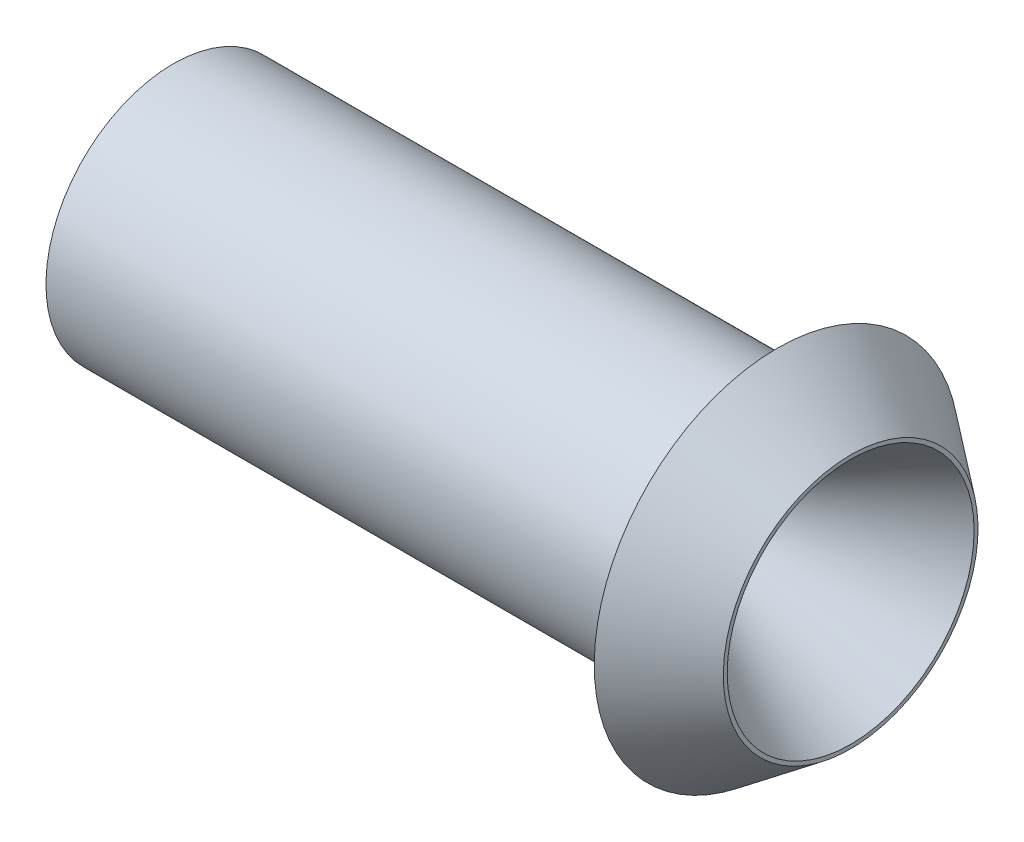
ISO-10303-21;
HEADER;
FILE_DESCRIPTION(('STEP AP214'),'2;1');
FILE_NAME('part.step','',(''),(''),'','','');
FILE_SCHEMA(('AUTOMOTIVE_DESIGN { 1 0 10303 214 1 1 1 1 }'));
ENDSEC;
DATA;
#1=APPLICATION_CONTEXT('core data for automotive mechanical design processes');
#2=APPLICATION_PROTOCOL_DEFINITION('international standard','automotive_design',2000,#1);
#3=PRODUCT_CONTEXT('',#1,'mechanical');
#4=PRODUCT('Part','Part','',(#3));
#5=PRODUCT_RELATED_PRODUCT_CATEGORY('part','',(#4));
#6=PRODUCT_DEFINITION_FORMATION('','',#4);
#7=PRODUCT_DEFINITION_CONTEXT('part definition',#1,'design');
#8=PRODUCT_DEFINITION('design','',#6,#7);
#9=PRODUCT_DEFINITION_SHAPE('','',#8);
#10=(LENGTH_UNIT() NAMED_UNIT(*) SI_UNIT(.MILLI.,.METRE.));
#11=(NAMED_UNIT(*) PLANE_ANGLE_UNIT() SI_UNIT($,.RADIAN.));
#12=(NAMED_UNIT(*) SI_UNIT($,.STERADIAN.) SOLID_ANGLE_UNIT());
#13=UNCERTAINTY_MEASURE_WITH_UNIT(LENGTH_MEASURE(1.E-05),#10,'distance_accuracy_value','');
#14=(GEOMETRIC_REPRESENTATION_CONTEXT(3) GLOBAL_UNCERTAINTY_ASSIGNED_CONTEXT((#13)) GLOBAL_UNIT_ASSIGNED_CONTEXT((#10,
#11,#12)) REPRESENTATION_CONTEXT('',''));
#15=CARTESIAN_POINT('',(0.,0.,0.));
#16=DIRECTION('',(0.,0.,1.));
#17=DIRECTION('',(1.,0.,0.));
#18=AXIS2_PLACEMENT_3D('',#15,#16,#17);
#19=CARTESIAN_POINT('',(32.6562615480863,0.,0.));
#20=DIRECTION('',(-1.,0.,0.));
#21=DIRECTION('',(0.,-1.,0.));
#22=AXIS2_PLACEMENT_3D('',#19,#20,#21);
#23=CONICAL_SURFACE('',#22,2.24281999999999,0.174532925199433);
#24=CARTESIAN_POINT('',(0.,0.,0.));
#25=DIRECTION('',(1.,0.,0.));
#26=DIRECTION('',(0.,1.,0.));
#27=AXIS2_PLACEMENT_3D('',#24,#25,#26);
#28=CIRCLE('',#27,8.00099999999999);
#29=CARTESIAN_POINT('',(0.,-8.00099999999999,0.));
#30=VERTEX_POINT('',#29);
#31=EDGE_CURVE('E82',#30,#30,#28,.T.);
#32=CARTESIAN_POINT('',(32.6562615480863,0.,0.));
#33=DIRECTION('',(1.,0.,0.));
#34=DIRECTION('',(0.,1.,0.));
#35=AXIS2_PLACEMENT_3D('',#32,#33,#34);
#36=CIRCLE('',#35,2.24281999999999);
#37=CARTESIAN_POINT('',(32.6562615480863,-2.24282,0.));
#38=VERTEX_POINT('',#37);
#39=EDGE_CURVE('E10',#38,#38,#36,.T.);
#40=CARTESIAN_POINT('',(0.,-8.00099999999999,0.));
#41=CARTESIAN_POINT('',(0.340169391125899,-7.94101895833333,0.));
#42=CARTESIAN_POINT('',(0.680338782251798,-7.88103791666666,0.));
#43=CARTESIAN_POINT('',(1.3606775645036,-7.76107583333333,0.));
#44=CARTESIAN_POINT('',(1.70084695562949,-7.70109479166666,0.));
#45=CARTESIAN_POINT('',(2.38118573788129,-7.58113270833333,0.));
#46=CARTESIAN_POINT('',(2.72135512900719,-7.52115166666666,0.));
#47=CARTESIAN_POINT('',(3.40169391125898,-7.40118958333333,0.));
#48=CARTESIAN_POINT('',(3.74186330238488,-7.34120854166666,0.));
#49=CARTESIAN_POINT('',(4.42220208463668,-7.22124645833333,0.));
#50=CARTESIAN_POINT('',(4.76237147576258,-7.16126541666666,0.));
#51=CARTESIAN_POINT('',(5.44271025801438,-7.04130333333333,0.));
#52=CARTESIAN_POINT('',(5.78287964914028,-6.98132229166666,0.));
#53=CARTESIAN_POINT('',(6.46321843139207,-6.86136020833333,0.));
#54=CARTESIAN_POINT('',(6.80338782251797,-6.80137916666666,0.));
#55=CARTESIAN_POINT('',(7.48372660476977,-6.68141708333333,0.));
#56=CARTESIAN_POINT('',(7.82389599589567,-6.62143604166666,0.));
#57=CARTESIAN_POINT('',(8.50423477814746,-6.50147395833333,0.));
#58=CARTESIAN_POINT('',(8.84440416927336,-6.44149291666666,0.));
#59=CARTESIAN_POINT('',(9.52474295152516,-6.32153083333333,0.));
#60=CARTESIAN_POINT('',(9.86491234265106,-6.26154979166666,0.));
#61=CARTESIAN_POINT('',(10.5452511249029,-6.14158770833333,0.));
#62=CARTESIAN_POINT('',(10.8854205160288,-6.08160666666666,0.));
#63=CARTESIAN_POINT('',(11.5657592982806,-5.96164458333333,0.));
#64=CARTESIAN_POINT('',(11.9059286894064,-5.90166354166666,0.));
#65=CARTESIAN_POINT('',(12.5862674716582,-5.78170145833333,0.));
#66=CARTESIAN_POINT('',(12.9264368627841,-5.72172041666666,0.));
#67=CARTESIAN_POINT('',(13.6067756450359,-5.60175833333333,0.));
#68=CARTESIAN_POINT('',(13.9469450361618,-5.54177729166666,0.));
#69=CARTESIAN_POINT('',(14.6272838184136,-5.42181520833333,0.));
#70=CARTESIAN_POINT('',(14.9674532095395,-5.36183416666666,0.));
#71=CARTESIAN_POINT('',(15.6477919917913,-5.24187208333333,0.));
#72=CARTESIAN_POINT('',(15.9879613829172,-5.18189104166666,0.));
#73=CARTESIAN_POINT('',(16.668300165169,-5.06192895833333,0.));
#74=CARTESIAN_POINT('',(17.0084695562949,-5.00194791666666,0.));
#75=CARTESIAN_POINT('',(17.6888083385467,-4.88198583333333,0.));
#76=CARTESIAN_POINT('',(18.0289777296726,-4.82200479166666,0.));
#77=CARTESIAN_POINT('',(18.7093165119244,-4.70204270833333,0.));
#78=CARTESIAN_POINT('',(19.0494859030503,-4.64206166666666,0.));
#79=CARTESIAN_POINT('',(19.7298246853021,-4.52209958333333,0.));
#80=CARTESIAN_POINT('',(20.069994076428,-4.46211854166666,0.));
#81=CARTESIAN_POINT('',(20.7503328586798,-4.34215645833333,0.));
#82=CARTESIAN_POINT('',(21.0905022498057,-4.28217541666666,0.));
#83=CARTESIAN_POINT('',(21.7708410320575,-4.16221333333333,0.));
#84=CARTESIAN_POINT('',(22.1110104231834,-4.10223229166666,0.));
#85=CARTESIAN_POINT('',(22.7913492054352,-3.98227020833333,0.));
#86=CARTESIAN_POINT('',(23.1315185965611,-3.92228916666666,0.));
#87=CARTESIAN_POINT('',(23.8118573788129,-3.80232708333333,0.));
#88=CARTESIAN_POINT('',(24.1520267699388,-3.74234604166666,0.));
#89=CARTESIAN_POINT('',(24.8323655521906,-3.62238395833333,0.));
#90=CARTESIAN_POINT('',(25.1725349433165,-3.56240291666666,0.));
#91=CARTESIAN_POINT('',(25.8528737255683,-3.44244083333333,0.));
#92=CARTESIAN_POINT('',(26.1930431166942,-3.38245979166666,0.));
#93=CARTESIAN_POINT('',(26.873381898946,-3.26249770833333,0.));
#94=CARTESIAN_POINT('',(27.2135512900719,-3.20251666666666,0.));
#95=CARTESIAN_POINT('',(27.8938900723237,-3.08255458333333,0.));
#96=CARTESIAN_POINT('',(28.2340594634496,-3.02257354166666,0.));
#97=CARTESIAN_POINT('',(28.9143982457014,-2.90261145833333,0.));
#98=CARTESIAN_POINT('',(29.2545676368273,-2.84263041666666,0.));
#99=CARTESIAN_POINT('',(29.9349064190791,-2.72266833333333,0.));
#100=CARTESIAN_POINT('',(30.275075810205,-2.66268729166666,0.));
#101=CARTESIAN_POINT('',(30.9554145924568,-2.54272520833333,0.));
#102=CARTESIAN_POINT('',(31.2955839835827,-2.48274416666666,0.));
#103=CARTESIAN_POINT('',(31.9759227658345,-2.36278208333333,0.));
#104=CARTESIAN_POINT('',(32.3160921569604,-2.30280104166666,0.));
#105=CARTESIAN_POINT('',(32.6562615480863,-2.24282,0.));
#106=B_SPLINE_CURVE_WITH_KNOTS('',3,(#40,#41,#42,#43,#44,#45,#46,#47,#48,#49,#50,#51,#52,#53,
#54,#55,#56,#57,#58,#59,#60,#61,#62,#63,#64,#65,#66,#67,#68,#69,#70,#71,#72,#73,#74,#75,#76,#77,
#78,#79,#80,#81,#82,#83,#84,#85,#86,#87,#88,#89,#90,#91,#92,#93,#94,#95,#96,#97,#98,#99,#100,
#101,#102,#103,#104,#105),.UNSPECIFIED.,.F.,.F.,(4,2,2,2,2,2,2,2,2,2,2,2,2,2,2,2,2,2,2,2,2,2,2,
2,2,2,2,2,2,2,2,2,4),(0.,1.03625115689463,2.07250231378925,3.10875347068387,4.1450046275785,
5.18125578447312,6.21750694136774,7.25375809826237,8.29000925515699,9.32626041205162,
10.3625115689462,11.3987627258409,12.4350138827355,13.4712650396301,14.5075161965247,
15.5437673534194,16.580018510314,17.6162696672086,18.6525208241032,19.6887719809978,
20.7250231378925,21.7612742947871,22.7975254516817,23.8337766085763,24.870027765471,
25.9062789223656,26.9425300792602,27.9787812361548,29.0150323930495,30.0512835499441,
31.0875347068387,32.1237858637333,33.160037020628),.UNSPECIFIED.);
#107=EDGE_CURVE('BSEAM45',#30,#38,#106,.T.);
#108=ORIENTED_EDGE('',*,*,#31,.F.);
#109=ORIENTED_EDGE('',*,*,#39,.T.);
#110=ORIENTED_EDGE('',*,*,#107,.T.);
#111=ORIENTED_EDGE('',*,*,#107,.F.);
#112=EDGE_LOOP('',(#108,#110,#109,#111));
#113=FACE_BOUND('',#112,.T.);
#114=ADVANCED_FACE('F45',(#113),#23,.F.);
#115=CARTESIAN_POINT('',(43.8997218672132,0.,0.));
#116=DIRECTION('',(1.,0.,0.));
#117=DIRECTION('',(0.,1.,0.));
#118=AXIS2_PLACEMENT_3D('',#115,#116,#117);
#119=CYLINDRICAL_SURFACE('',#118,2.24282);
#120=ORIENTED_EDGE('',*,*,#39,.F.);
#121=EDGE_LOOP('',(#120));
#122=FACE_BOUND('',#121,.T.);
#123=CARTESIAN_POINT('',(33.9262615480863,0.,0.));
#124=DIRECTION('',(1.,0.,0.));
#125=DIRECTION('',(0.,1.,0.));
#126=AXIS2_PLACEMENT_3D('',#123,#124,#125);
#127=CIRCLE('',#126,2.24282);
#128=CARTESIAN_POINT('',(33.9262615480863,2.24281999999999,0.));
#129=VERTEX_POINT('',#128);
#130=EDGE_CURVE('E52',#129,#129,#127,.T.);
#131=ORIENTED_EDGE('',*,*,#130,.T.);
#132=EDGE_LOOP('',(#131));
#133=FACE_BOUND('',#132,.T.);
#134=ADVANCED_FACE('F91',(#122,#133),#119,.F.);
#135=CARTESIAN_POINT('',(43.8997218672132,0.,0.));
#136=DIRECTION('',(1.,0.,0.));
#137=DIRECTION('',(0.,1.,0.));
#138=AXIS2_PLACEMENT_3D('',#135,#136,#137);
#139=CONICAL_SURFACE('',#138,8.001,0.523598775598301);
#140=CARTESIAN_POINT('',(43.8997218672132,0.,0.));
#141=DIRECTION('',(1.,0.,0.));
#142=DIRECTION('',(0.,1.,0.));
#143=AXIS2_PLACEMENT_3D('',#140,#141,#142);
#144=CIRCLE('',#143,8.001);
#145=CARTESIAN_POINT('',(43.8997218672132,8.00099999999999,0.));
#146=VERTEX_POINT('',#145);
#147=EDGE_CURVE('E58',#146,#146,#144,.T.);
#148=CARTESIAN_POINT('',(33.9262615480863,2.24281999999999,0.));
#149=CARTESIAN_POINT('',(34.0301517597438,2.30280104166666,0.));
#150=CARTESIAN_POINT('',(34.1340419714014,2.36278208333333,0.));
#151=CARTESIAN_POINT('',(34.3418223947166,2.48274416666666,0.));
#152=CARTESIAN_POINT('',(34.4457126063741,2.54272520833333,0.));
#153=CARTESIAN_POINT('',(34.6534930296893,2.66268729166666,0.));
#154=CARTESIAN_POINT('',(34.7573832413468,2.72266833333333,0.));
#155=CARTESIAN_POINT('',(34.965163664662,2.84263041666666,0.));
#156=CARTESIAN_POINT('',(35.0690538763196,2.90261145833333,0.));
#157=CARTESIAN_POINT('',(35.2768342996347,3.02257354166666,0.));
#158=CARTESIAN_POINT('',(35.3807245112923,3.08255458333333,0.));
#159=CARTESIAN_POINT('',(35.5885049346074,3.20251666666666,0.));
#160=CARTESIAN_POINT('',(35.692395146265,3.26249770833333,0.));
#161=CARTESIAN_POINT('',(35.9001755695801,3.38245979166666,0.));
#162=CARTESIAN_POINT('',(36.0040657812377,3.44244083333333,0.));
#163=CARTESIAN_POINT('',(36.2118462045528,3.56240291666666,0.));
#164=CARTESIAN_POINT('',(36.3157364162104,3.62238395833333,0.));
#165=CARTESIAN_POINT('',(36.5235168395256,3.74234604166666,0.));
#166=CARTESIAN_POINT('',(36.6274070511831,3.80232708333333,0.));
#167=CARTESIAN_POINT('',(36.8351874744983,3.92228916666666,0.));
#168=CARTESIAN_POINT('',(36.9390776861559,3.98227020833333,0.));
#169=CARTESIAN_POINT('',(37.146858109471,4.10223229166666,0.));
#170=CARTESIAN_POINT('',(37.2507483211286,4.16221333333333,0.));
#171=CARTESIAN_POINT('',(37.4585287444437,4.28217541666666,0.));
#172=CARTESIAN_POINT('',(37.5624189561013,4.34215645833333,0.));
#173=CARTESIAN_POINT('',(37.7701993794164,4.46211854166666,0.));
#174=CARTESIAN_POINT('',(37.874089591074,4.52209958333333,0.));
#175=CARTESIAN_POINT('',(38.0818700143891,4.64206166666666,0.));
#176=CARTESIAN_POINT('',(38.1857602260467,4.70204270833333,0.));
#177=CARTESIAN_POINT('',(38.3935406493619,4.82200479166666,0.));
#178=CARTESIAN_POINT('',(38.4974308610194,4.88198583333333,0.));
#179=CARTESIAN_POINT('',(38.7052112843346,5.00194791666666,0.));
#180=CARTESIAN_POINT('',(38.8091014959922,5.06192895833333,0.));
#181=CARTESIAN_POINT('',(39.0168819193073,5.18189104166666,0.));
#182=CARTESIAN_POINT('',(39.1207721309649,5.24187208333333,0.));
#183=CARTESIAN_POINT('',(39.32855255428,5.36183416666666,0.));
#184=CARTESIAN_POINT('',(39.4324427659376,5.42181520833333,0.));
#185=CARTESIAN_POINT('',(39.6402231892527,5.54177729166666,0.));
#186=CARTESIAN_POINT('',(39.7441134009103,5.60175833333333,0.));
#187=CARTESIAN_POINT('',(39.9518938242254,5.72172041666666,0.));
#188=CARTESIAN_POINT('',(40.055784035883,5.78170145833333,0.));
#189=CARTESIAN_POINT('',(40.2635644591982,5.90166354166666,0.));
#190=CARTESIAN_POINT('',(40.3674546708557,5.96164458333333,0.));
#191=CARTESIAN_POINT('',(40.5752350941709,6.08160666666666,0.));
#192=CARTESIAN_POINT('',(40.6791253058284,6.14158770833333,0.));
#193=CARTESIAN_POINT('',(40.8869057291436,6.26154979166666,0.));
#194=CARTESIAN_POINT('',(40.9907959408012,6.32153083333333,0.));
#195=CARTESIAN_POINT('',(41.1985763641163,6.44149291666666,0.));
#196=CARTESIAN_POINT('',(41.3024665757739,6.50147395833333,0.));
#197=CARTESIAN_POINT('',(41.510246999089,6.62143604166666,0.));
#198=CARTESIAN_POINT('',(41.6141372107466,6.68141708333333,0.));
#199=CARTESIAN_POINT('',(41.8219176340617,6.80137916666666,0.));
#200=CARTESIAN_POINT('',(41.9258078457193,6.86136020833333,0.));
#201=CARTESIAN_POINT('',(42.1335882690344,6.98132229166666,0.));
#202=CARTESIAN_POINT('',(42.237478480692,7.04130333333333,0.));
#203=CARTESIAN_POINT('',(42.4452589040072,7.16126541666666,0.));
#204=CARTESIAN_POINT('',(42.5491491156647,7.22124645833333,0.));
#205=CARTESIAN_POINT('',(42.7569295389799,7.34120854166666,0.));
#206=CARTESIAN_POINT('',(42.8608197506374,7.40118958333333,0.));
#207=CARTESIAN_POINT('',(43.0686001739526,7.52115166666666,0.));
#208=CARTESIAN_POINT('',(43.1724903856102,7.58113270833333,0.));
#209=CARTESIAN_POINT('',(43.3802708089253,7.70109479166666,0.));
#210=CARTESIAN_POINT('',(43.4841610205829,7.76107583333333,0.));
#211=CARTESIAN_POINT('',(43.691941443898,7.88103791666666,0.));
#212=CARTESIAN_POINT('',(43.7958316555556,7.94101895833333,0.));
#213=CARTESIAN_POINT('',(43.8997218672132,8.00099999999999,0.));
#214=B_SPLINE_CURVE_WITH_KNOTS('',3,(#148,#149,#150,#151,#152,#153,#154,#155,#156,#157,#158,
#159,#160,#161,#162,#163,#164,#165,#166,#167,#168,#169,#170,#171,#172,#173,#174,#175,#176,#177,
#178,#179,#180,#181,#182,#183,#184,#185,#186,#187,#188,#189,#190,#191,#192,#193,#194,#195,#196,
#197,#198,#199,#200,#201,#202,#203,#204,#205,#206,#207,#208,#209,#210,#211,#212,#213),
.UNSPECIFIED.,.F.,.F.,(4,2,2,2,2,2,2,2,2,2,2,2,2,2,2,2,2,2,2,2,2,2,2,2,2,2,2,2,2,2,2,2,4),(0.,
0.359886249999996,0.719772499999993,1.07965874999999,1.43954499999999,1.79943124999999,
2.15931749999999,2.51920374999999,2.87908999999998,3.23897624999999,3.59886249999998,
3.95874874999998,4.31863499999998,4.67852124999998,5.03840749999997,5.39829374999998,
5.75817999999997,6.11806624999997,6.47795249999997,6.83783874999997,7.19772499999997,
7.55761124999997,7.91749749999996,8.27738374999996,8.63726999999996,8.99715624999996,
9.35704249999996,9.71692874999996,10.076815,10.43670125,10.7965875,11.15647375,
11.5163599999999),.UNSPECIFIED.);
#215=EDGE_CURVE('BSEAM95',#129,#146,#214,.T.);
#216=ORIENTED_EDGE('',*,*,#130,.F.);
#217=ORIENTED_EDGE('',*,*,#147,.T.);
#218=ORIENTED_EDGE('',*,*,#215,.T.);
#219=ORIENTED_EDGE('',*,*,#215,.F.);
#220=EDGE_LOOP('',(#216,#218,#217,#219));
#221=FACE_BOUND('',#220,.T.);
#222=ADVANCED_FACE('F95',(#221),#139,.F.);
#223=CARTESIAN_POINT('',(43.8997218672132,0.,0.));
#224=DIRECTION('',(-1.,0.,0.));
#225=DIRECTION('',(0.,-1.,0.));
#226=AXIS2_PLACEMENT_3D('',#223,#224,#225);
#227=PLANE('',#226);
#228=ORIENTED_EDGE('',*,*,#147,.F.);
#229=EDGE_LOOP('',(#228));
#230=FACE_BOUND('',#229,.T.);
#231=CARTESIAN_POINT('',(43.8997218672132,0.,0.));
#232=DIRECTION('',(1.,0.,0.));
#233=DIRECTION('',(0.,1.,0.));
#234=AXIS2_PLACEMENT_3D('',#231,#232,#233);
#235=CIRCLE('',#234,8.255);
#236=CARTESIAN_POINT('',(43.8997218672132,8.25499999999999,0.));
#237=VERTEX_POINT('',#236);
#238=EDGE_CURVE('E64',#237,#237,#235,.T.);
#239=ORIENTED_EDGE('',*,*,#238,.T.);
#240=EDGE_LOOP('',(#239));
#241=FACE_BOUND('',#240,.T.);
#242=ADVANCED_FACE('F100',(#230,#241),#227,.F.);
#243=CARTESIAN_POINT('',(39.1301900738272,0.,0.));
#244=DIRECTION('',(-1.,0.,0.));
#245=DIRECTION('',(0.,-1.,0.));
#246=AXIS2_PLACEMENT_3D('',#243,#244,#245);
#247=CONICAL_SURFACE('',#246,11.8491,0.645771823237897);
#248=ORIENTED_EDGE('',*,*,#238,.F.);
#249=EDGE_LOOP('',(#248));
#250=FACE_BOUND('',#249,.T.);
#251=CARTESIAN_POINT('',(39.1301900738272,0.,0.));
#252=DIRECTION('',(1.,0.,0.));
#253=DIRECTION('',(0.,1.,0.));
#254=AXIS2_PLACEMENT_3D('',#251,#252,#253);
#255=CIRCLE('',#254,11.8491);
#256=CARTESIAN_POINT('',(39.1301900738272,11.8491,0.));
#257=VERTEX_POINT('',#256);
#258=EDGE_CURVE('E70',#257,#257,#255,.T.);
#259=ORIENTED_EDGE('',*,*,#258,.T.);
#260=EDGE_LOOP('',(#259));
#261=FACE_BOUND('',#260,.T.);
#262=ADVANCED_FACE('F106',(#250,#261),#247,.T.);
#263=CARTESIAN_POINT('',(39.1301900738272,0.,0.));
#264=DIRECTION('',(1.,0.,0.));
#265=DIRECTION('',(0.,1.,0.));
#266=AXIS2_PLACEMENT_3D('',#263,#264,#265);
#267=PLANE('',#266);
#268=ORIENTED_EDGE('',*,*,#258,.F.);
#269=EDGE_LOOP('',(#268));
#270=FACE_BOUND('',#269,.T.);
#271=CARTESIAN_POINT('',(39.1301900738272,0.,0.));
#272=DIRECTION('',(1.,0.,0.));
#273=DIRECTION('',(0.,1.,0.));
#274=AXIS2_PLACEMENT_3D('',#271,#272,#273);
#275=CIRCLE('',#274,8.255);
#276=CARTESIAN_POINT('',(39.1301900738272,8.255,0.));
#277=VERTEX_POINT('',#276);
#278=EDGE_CURVE('E74',#277,#277,#275,.T.);
#279=ORIENTED_EDGE('',*,*,#278,.T.);
#280=EDGE_LOOP('',(#279));
#281=FACE_BOUND('',#280,.T.);
#282=ADVANCED_FACE('F110',(#270,#281),#267,.F.);
#283=CARTESIAN_POINT('',(43.8997218672132,0.,0.));
#284=DIRECTION('',(1.,0.,0.));
#285=DIRECTION('',(0.,1.,0.));
#286=AXIS2_PLACEMENT_3D('',#283,#284,#285);
#287=CYLINDRICAL_SURFACE('',#286,8.255);
#288=ORIENTED_EDGE('',*,*,#278,.F.);
#289=EDGE_LOOP('',(#288));
#290=FACE_BOUND('',#289,.T.);
#291=CARTESIAN_POINT('',(0.,0.,0.));
#292=DIRECTION('',(1.,0.,0.));
#293=DIRECTION('',(0.,1.,0.));
#294=AXIS2_PLACEMENT_3D('',#291,#292,#293);
#295=CIRCLE('',#294,8.25499999999999);
#296=CARTESIAN_POINT('',(0.,8.25499999999999,0.));
#297=VERTEX_POINT('',#296);
#298=EDGE_CURVE('E78',#297,#297,#295,.T.);
#299=ORIENTED_EDGE('',*,*,#298,.T.);
#300=EDGE_LOOP('',(#299));
#301=FACE_BOUND('',#300,.T.);
#302=ADVANCED_FACE('F114',(#290,#301),#287,.T.);
#303=CARTESIAN_POINT('',(0.,0.,0.));
#304=DIRECTION('',(1.,0.,0.));
#305=DIRECTION('',(0.,1.,0.));
#306=AXIS2_PLACEMENT_3D('',#303,#304,#305);
#307=PLANE('',#306);
#308=ORIENTED_EDGE('',*,*,#298,.F.);
#309=EDGE_LOOP('',(#308));
#310=FACE_BOUND('',#309,.T.);
#311=ORIENTED_EDGE('',*,*,#31,.T.);
#312=EDGE_LOOP('',(#311));
#313=FACE_BOUND('',#312,.T.);
#314=ADVANCED_FACE('F88',(#310,#313),#307,.F.);
#315=CLOSED_SHELL('',(#114,#134,#222,#242,#262,#282,#302,#314));
#316=MANIFOLD_SOLID_BREP('B2',#315);
#317=ADVANCED_BREP_SHAPE_REPRESENTATION('',(#18,#316),#14);
#318=SHAPE_DEFINITION_REPRESENTATION(#9,#317);
ENDSEC;
END-ISO-10303-21;
